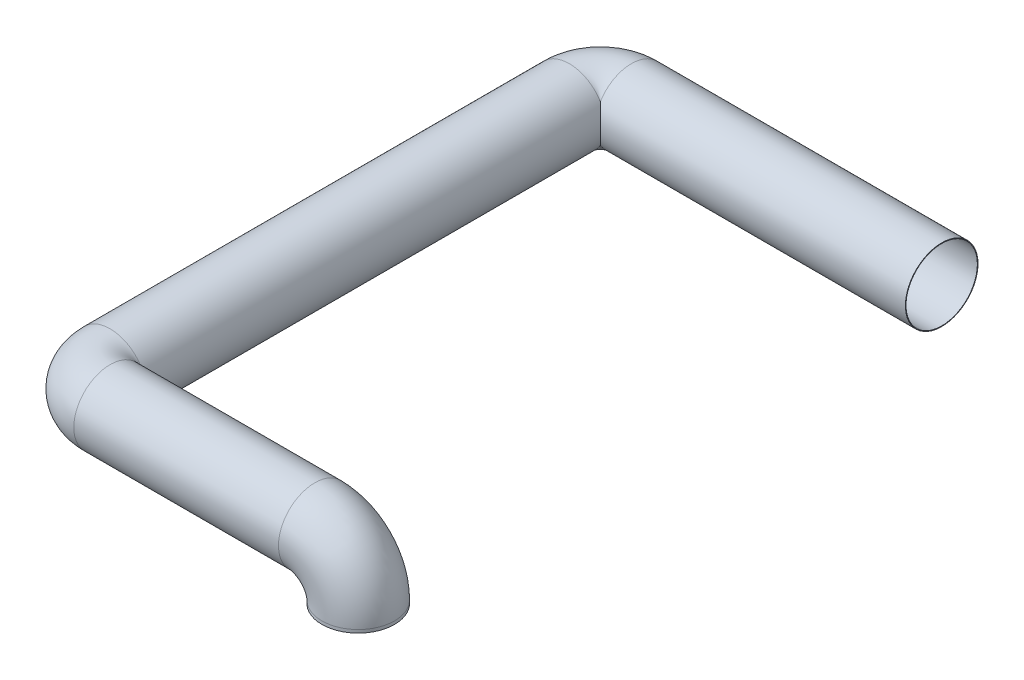
ISO-10303-21;
HEADER;
FILE_DESCRIPTION(('STEP AP214'),'2;1');
FILE_NAME('part.step','',(''),(''),'','','');
FILE_SCHEMA(('AUTOMOTIVE_DESIGN { 1 0 10303 214 1 1 1 1 }'));
ENDSEC;
DATA;
#1=APPLICATION_CONTEXT('core data for automotive mechanical design processes');
#2=APPLICATION_PROTOCOL_DEFINITION('international standard','automotive_design',2000,#1);
#3=PRODUCT_CONTEXT('',#1,'mechanical');
#4=PRODUCT('Part','Part','',(#3));
#5=PRODUCT_RELATED_PRODUCT_CATEGORY('part','',(#4));
#6=PRODUCT_DEFINITION_FORMATION('','',#4);
#7=PRODUCT_DEFINITION_CONTEXT('part definition',#1,'design');
#8=PRODUCT_DEFINITION('design','',#6,#7);
#9=PRODUCT_DEFINITION_SHAPE('','',#8);
#10=(LENGTH_UNIT() NAMED_UNIT(*) SI_UNIT(.MILLI.,.METRE.));
#11=(NAMED_UNIT(*) PLANE_ANGLE_UNIT() SI_UNIT($,.RADIAN.));
#12=(NAMED_UNIT(*) SI_UNIT($,.STERADIAN.) SOLID_ANGLE_UNIT());
#13=UNCERTAINTY_MEASURE_WITH_UNIT(LENGTH_MEASURE(1.E-05),#10,'distance_accuracy_value','');
#14=(GEOMETRIC_REPRESENTATION_CONTEXT(3) GLOBAL_UNCERTAINTY_ASSIGNED_CONTEXT((#13)) GLOBAL_UNIT_ASSIGNED_CONTEXT((#10,
#11,#12)) REPRESENTATION_CONTEXT('',''));
#15=CARTESIAN_POINT('',(0.,0.,0.));
#16=DIRECTION('',(0.,0.,1.));
#17=DIRECTION('',(1.,0.,0.));
#18=AXIS2_PLACEMENT_3D('',#15,#16,#17);
#19=CARTESIAN_POINT('',(12.7,0.,-187.96));
#20=DIRECTION('',(-1.,0.,0.));
#21=DIRECTION('',(0.,0.,1.));
#22=AXIS2_PLACEMENT_3D('',#19,#20,#21);
#23=CIRCLE('',#22,14.859);
#24=TRIMMED_CURVE('',#23,(PARAMETER_VALUE(-2.59577063902792)),
(PARAMETER_VALUE(2.59577063902792)),.T.,.PARAMETER.);
#25=CARTESIAN_POINT('',(12.7,0.,-200.66));
#26=DIRECTION('',(0.,1.,0.));
#27=AXIS1_PLACEMENT('',#25,#26);
#28=SURFACE_OF_REVOLUTION('',#24,#27);
#29=CARTESIAN_POINT('',(12.7,0.,-213.36));
#30=DIRECTION('',(1.,0.,0.));
#31=DIRECTION('',(0.,0.,-1.));
#32=AXIS2_PLACEMENT_3D('',#29,#30,#31);
#33=CIRCLE('',#32,14.859);
#34=CARTESIAN_POINT('',(12.7,-7.71361659664258,-200.66));
#35=VERTEX_POINT('',#34);
#36=CARTESIAN_POINT('',(12.7,7.71361659664258,-200.66));
#37=VERTEX_POINT('',#36);
#38=EDGE_CURVE('E72',#35,#37,#33,.T.);
#39=ORIENTED_EDGE('',*,*,#38,.F.);
#40=CARTESIAN_POINT('',(0.,0.,-200.66));
#41=DIRECTION('',(0.,0.,1.));
#42=DIRECTION('',(1.,0.,0.));
#43=AXIS2_PLACEMENT_3D('',#40,#41,#42);
#44=CIRCLE('',#43,14.859);
#45=EDGE_CURVE('E70',#35,#37,#44,.F.);
#46=ORIENTED_EDGE('',*,*,#45,.T.);
#47=EDGE_LOOP('',(#39,#46));
#48=FACE_BOUND('',#47,.T.);
#49=ADVANCED_FACE('F33',(#48),#28,.T.);
#50=CARTESIAN_POINT('',(114.252492190507,-17.78,0.));
#51=DIRECTION('',(0.,-1.,0.));
#52=DIRECTION('',(1.,0.,0.));
#53=AXIS2_PLACEMENT_3D('',#50,#51,#52);
#54=CYLINDRICAL_SURFACE('',#53,14.859);
#55=CARTESIAN_POINT('',(114.252492190507,-17.78,0.));
#56=DIRECTION('',(0.,1.,0.));
#57=DIRECTION('',(-1.,0.,0.));
#58=AXIS2_PLACEMENT_3D('',#55,#56,#57);
#59=CIRCLE('',#58,14.859);
#60=CARTESIAN_POINT('',(129.111492190507,-17.78,0.));
#61=VERTEX_POINT('',#60);
#62=EDGE_CURVE('E81',#61,#61,#59,.T.);
#63=ORIENTED_EDGE('',*,*,#62,.F.);
#64=EDGE_LOOP('',(#63));
#65=FACE_BOUND('',#64,.T.);
#66=CARTESIAN_POINT('',(114.252492190507,-19.05,0.));
#67=DIRECTION('',(0.,1.,0.));
#68=DIRECTION('',(-1.,0.,0.));
#69=AXIS2_PLACEMENT_3D('',#66,#67,#68);
#70=CIRCLE('',#69,14.859);
#71=CARTESIAN_POINT('',(99.393492190507,-19.05,0.));
#72=VERTEX_POINT('',#71);
#73=EDGE_CURVE('E78',#72,#72,#70,.T.);
#74=ORIENTED_EDGE('',*,*,#73,.T.);
#75=EDGE_LOOP('',(#74));
#76=FACE_BOUND('',#75,.T.);
#77=ADVANCED_FACE('F103',(#65,#76),#54,.T.);
#78=CARTESIAN_POINT('',(96.472492190507,-17.78,0.));
#79=DIRECTION('',(0.,0.,-1.));
#80=DIRECTION('',(0.,1.,0.));
#81=AXIS2_PLACEMENT_3D('',#78,#79,#80);
#82=TOROIDAL_SURFACE('',#81,17.78,14.859);
#83=CARTESIAN_POINT('',(96.472492190507,0.,0.));
#84=DIRECTION('',(1.,0.,0.));
#85=DIRECTION('',(0.,0.,-1.));
#86=AXIS2_PLACEMENT_3D('',#83,#84,#85);
#87=CIRCLE('',#86,14.859);
#88=CARTESIAN_POINT('',(96.472492190507,14.859,0.));
#89=VERTEX_POINT('',#88);
#90=EDGE_CURVE('E67',#89,#89,#87,.F.);
#91=CARTESIAN_POINT('',(96.472492190507,-17.78,0.));
#92=DIRECTION('',(0.,0.,-1.));
#93=DIRECTION('',(0.,1.,0.));
#94=AXIS2_PLACEMENT_3D('',#91,#92,#93);
#95=CIRCLE('',#94,32.639);
#96=EDGE_CURVE('',#89,#61,#95,.T.);
#97=ORIENTED_EDGE('',*,*,#90,.F.);
#98=ORIENTED_EDGE('',*,*,#62,.T.);
#99=ORIENTED_EDGE('',*,*,#96,.T.);
#100=ORIENTED_EDGE('',*,*,#96,.F.);
#101=EDGE_LOOP('',(#97,#99,#98,#100));
#102=FACE_BOUND('',#101,.T.);
#103=ADVANCED_FACE('F100',(#102),#82,.T.);
#104=CARTESIAN_POINT('',(12.7,0.,0.));
#105=DIRECTION('',(1.,0.,0.));
#106=DIRECTION('',(0.,0.,-1.));
#107=AXIS2_PLACEMENT_3D('',#104,#105,#106);
#108=CYLINDRICAL_SURFACE('',#107,14.859);
#109=CARTESIAN_POINT('',(0.,0.,0.));
#110=DIRECTION('',(0.707106781186547,0.,0.707106781186547));
#111=DIRECTION('',(0.707106781186547,0.,-0.707106781186547));
#112=AXIS2_PLACEMENT_3D('',#109,#110,#111);
#113=ELLIPSE('',#112,21.0137993233018,14.859);
#114=CARTESIAN_POINT('',(12.7,7.71361659664255,-12.7));
#115=VERTEX_POINT('',#114);
#116=CARTESIAN_POINT('',(12.7,-7.71361659664255,-12.7));
#117=VERTEX_POINT('',#116);
#118=EDGE_CURVE('E11',#115,#117,#113,.F.);
#119=ORIENTED_EDGE('',*,*,#118,.F.);
#120=CARTESIAN_POINT('',(12.7,0.,0.));
#121=DIRECTION('',(1.,0.,0.));
#122=DIRECTION('',(0.,0.,-1.));
#123=AXIS2_PLACEMENT_3D('',#120,#121,#122);
#124=CIRCLE('',#123,14.859);
#125=EDGE_CURVE('E63',#117,#115,#124,.F.);
#126=ORIENTED_EDGE('',*,*,#125,.F.);
#127=EDGE_LOOP('',(#119,#126));
#128=FACE_BOUND('',#127,.T.);
#129=ORIENTED_EDGE('',*,*,#90,.T.);
#130=EDGE_LOOP('',(#129));
#131=FACE_BOUND('',#130,.T.);
#132=ADVANCED_FACE('F64',(#128,#131),#108,.T.);
#133=CARTESIAN_POINT('',(12.7,0.,0.));
#134=DIRECTION('',(-1.,0.,0.));
#135=DIRECTION('',(0.,0.,1.));
#136=AXIS2_PLACEMENT_3D('',#133,#134,#135);
#137=CIRCLE('',#136,14.859);
#138=TRIMMED_CURVE('',#137,(PARAMETER_VALUE(-2.59577063902792)),
(PARAMETER_VALUE(2.59577063902792)),.T.,.PARAMETER.);
#139=CARTESIAN_POINT('',(12.7,0.,-12.7));
#140=DIRECTION('',(0.,1.,0.));
#141=AXIS1_PLACEMENT('',#139,#140);
#142=SURFACE_OF_REVOLUTION('',#138,#141);
#143=ORIENTED_EDGE('',*,*,#125,.T.);
#144=CARTESIAN_POINT('',(0.,0.,-12.7));
#145=DIRECTION('',(0.,0.,1.));
#146=DIRECTION('',(1.,0.,0.));
#147=AXIS2_PLACEMENT_3D('',#144,#145,#146);
#148=CIRCLE('',#147,14.859);
#149=EDGE_CURVE('E60',#117,#115,#148,.F.);
#150=ORIENTED_EDGE('',*,*,#149,.F.);
#151=EDGE_LOOP('',(#143,#150));
#152=FACE_BOUND('',#151,.T.);
#153=ADVANCED_FACE('F69',(#152),#142,.T.);
#154=CARTESIAN_POINT('',(0.,0.,-200.66));
#155=DIRECTION('',(0.,0.,1.));
#156=DIRECTION('',(1.,0.,0.));
#157=AXIS2_PLACEMENT_3D('',#154,#155,#156);
#158=CYLINDRICAL_SURFACE('',#157,14.859);
#159=ORIENTED_EDGE('',*,*,#45,.F.);
#160=CARTESIAN_POINT('',(0.,0.,-213.36));
#161=DIRECTION('',(-0.707106781186547,0.,0.707106781186547));
#162=DIRECTION('',(0.707106781186547,0.,0.707106781186547));
#163=AXIS2_PLACEMENT_3D('',#160,#161,#162);
#164=ELLIPSE('',#163,21.0137993233018,14.859);
#165=EDGE_CURVE('E41',#35,#37,#164,.T.);
#166=ORIENTED_EDGE('',*,*,#165,.T.);
#167=EDGE_LOOP('',(#159,#166));
#168=FACE_BOUND('',#167,.T.);
#169=ORIENTED_EDGE('',*,*,#149,.T.);
#170=ORIENTED_EDGE('',*,*,#118,.T.);
#171=EDGE_LOOP('',(#169,#170));
#172=FACE_BOUND('',#171,.T.);
#173=ADVANCED_FACE('F58',(#168,#172),#158,.T.);
#174=CARTESIAN_POINT('',(12.7,0.,-213.36));
#175=DIRECTION('',(1.,0.,0.));
#176=DIRECTION('',(0.,0.,-1.));
#177=AXIS2_PLACEMENT_3D('',#174,#175,#176);
#178=CYLINDRICAL_SURFACE('',#177,14.859);
#179=ORIENTED_EDGE('',*,*,#165,.F.);
#180=ORIENTED_EDGE('',*,*,#38,.T.);
#181=EDGE_LOOP('',(#179,#180));
#182=FACE_BOUND('',#181,.T.);
#183=CARTESIAN_POINT('',(139.7,0.,-213.36));
#184=DIRECTION('',(1.,0.,0.));
#185=DIRECTION('',(0.,0.,-1.));
#186=AXIS2_PLACEMENT_3D('',#183,#184,#185);
#187=CIRCLE('',#186,14.859);
#188=CARTESIAN_POINT('',(139.7,0.,-228.219));
#189=VERTEX_POINT('',#188);
#190=EDGE_CURVE('E77',#189,#189,#187,.T.);
#191=ORIENTED_EDGE('',*,*,#190,.F.);
#192=EDGE_LOOP('',(#191));
#193=FACE_BOUND('',#192,.T.);
#194=ADVANCED_FACE('F35',(#182,#193),#178,.T.);
#195=CARTESIAN_POINT('',(114.252492190507,-19.05,0.));
#196=DIRECTION('',(0.,1.,0.));
#197=DIRECTION('',(0.,0.,1.));
#198=AXIS2_PLACEMENT_3D('',#195,#196,#197);
#199=PLANE('',#198);
#200=CARTESIAN_POINT('',(114.252492190507,-19.05,0.));
#201=DIRECTION('',(0.,1.,0.));
#202=DIRECTION('',(0.,0.,1.));
#203=AXIS2_PLACEMENT_3D('',#200,#201,#202);
#204=CIRCLE('',#203,14.605);
#205=CARTESIAN_POINT('',(114.252492190507,-19.05,14.605));
#206=VERTEX_POINT('',#205);
#207=EDGE_CURVE('E83',#206,#206,#204,.T.);
#208=ORIENTED_EDGE('',*,*,#207,.T.);
#209=EDGE_LOOP('',(#208));
#210=FACE_BOUND('',#209,.T.);
#211=ORIENTED_EDGE('',*,*,#73,.F.);
#212=EDGE_LOOP('',(#211));
#213=FACE_BOUND('',#212,.T.);
#214=ADVANCED_FACE('F112',(#210,#213),#199,.F.);
#215=CARTESIAN_POINT('',(139.7,0.,-213.36));
#216=DIRECTION('',(1.,0.,0.));
#217=DIRECTION('',(0.,0.,-1.));
#218=AXIS2_PLACEMENT_3D('',#215,#216,#217);
#219=PLANE('',#218);
#220=CARTESIAN_POINT('',(139.7,0.,-213.36));
#221=DIRECTION('',(1.,0.,0.));
#222=DIRECTION('',(0.,0.,-1.));
#223=AXIS2_PLACEMENT_3D('',#220,#221,#222);
#224=CIRCLE('',#223,14.605);
#225=CARTESIAN_POINT('',(139.7,0.,-227.965));
#226=VERTEX_POINT('',#225);
#227=EDGE_CURVE('E239',#226,#226,#224,.T.);
#228=ORIENTED_EDGE('',*,*,#227,.F.);
#229=EDGE_LOOP('',(#228));
#230=FACE_BOUND('',#229,.T.);
#231=ORIENTED_EDGE('',*,*,#190,.T.);
#232=EDGE_LOOP('',(#231));
#233=FACE_BOUND('',#232,.T.);
#234=ADVANCED_FACE('F114',(#230,#233),#219,.T.);
#235=CARTESIAN_POINT('',(114.252492190507,-17.78,0.));
#236=DIRECTION('',(0.,-1.,0.));
#237=DIRECTION('',(1.,0.,0.));
#238=AXIS2_PLACEMENT_3D('',#235,#236,#237);
#239=CYLINDRICAL_SURFACE('',#238,14.605);
#240=CARTESIAN_POINT('',(114.252492190507,-17.78,0.));
#241=DIRECTION('',(0.,1.,0.));
#242=DIRECTION('',(0.,0.,1.));
#243=AXIS2_PLACEMENT_3D('',#240,#241,#242);
#244=CIRCLE('',#243,14.605);
#245=CARTESIAN_POINT('',(128.857492190507,-17.78,0.));
#246=VERTEX_POINT('',#245);
#247=EDGE_CURVE('E87',#246,#246,#244,.T.);
#248=ORIENTED_EDGE('',*,*,#247,.T.);
#249=EDGE_LOOP('',(#248));
#250=FACE_BOUND('',#249,.T.);
#251=ORIENTED_EDGE('',*,*,#207,.F.);
#252=EDGE_LOOP('',(#251));
#253=FACE_BOUND('',#252,.T.);
#254=ADVANCED_FACE('F120',(#250,#253),#239,.F.);
#255=CARTESIAN_POINT('',(96.472492190507,-17.78,0.));
#256=DIRECTION('',(0.,0.,-1.));
#257=DIRECTION('',(0.,1.,0.));
#258=AXIS2_PLACEMENT_3D('',#255,#256,#257);
#259=TOROIDAL_SURFACE('',#258,17.78,14.605);
#260=CARTESIAN_POINT('',(96.472492190507,0.,0.));
#261=DIRECTION('',(-1.,0.,0.));
#262=DIRECTION('',(0.,0.,1.));
#263=AXIS2_PLACEMENT_3D('',#260,#261,#262);
#264=CIRCLE('',#263,14.605);
#265=CARTESIAN_POINT('',(96.472492190507,14.605,0.));
#266=VERTEX_POINT('',#265);
#267=EDGE_CURVE('E92',#266,#266,#264,.T.);
#268=CARTESIAN_POINT('',(96.472492190507,-17.78,0.));
#269=DIRECTION('',(0.,0.,-1.));
#270=DIRECTION('',(0.,1.,0.));
#271=AXIS2_PLACEMENT_3D('',#268,#269,#270);
#272=CIRCLE('',#271,32.385);
#273=EDGE_CURVE('',#266,#246,#272,.T.);
#274=ORIENTED_EDGE('',*,*,#267,.T.);
#275=ORIENTED_EDGE('',*,*,#247,.F.);
#276=ORIENTED_EDGE('',*,*,#273,.T.);
#277=ORIENTED_EDGE('',*,*,#273,.F.);
#278=EDGE_LOOP('',(#274,#276,#275,#277));
#279=FACE_BOUND('',#278,.T.);
#280=ADVANCED_FACE('F170',(#279),#259,.F.);
#281=CARTESIAN_POINT('',(12.7,0.,0.));
#282=DIRECTION('',(1.,0.,0.));
#283=DIRECTION('',(0.,0.,-1.));
#284=AXIS2_PLACEMENT_3D('',#281,#282,#283);
#285=CYLINDRICAL_SURFACE('',#284,14.605);
#286=CARTESIAN_POINT('',(12.7,0.,0.));
#287=DIRECTION('',(-1.,0.,0.));
#288=DIRECTION('',(0.,0.,1.));
#289=AXIS2_PLACEMENT_3D('',#286,#287,#288);
#290=CIRCLE('',#289,14.605);
#291=CARTESIAN_POINT('',(12.7,0.,14.605));
#292=VERTEX_POINT('',#291);
#293=EDGE_CURVE('E249',#292,#292,#290,.T.);
#294=ORIENTED_EDGE('',*,*,#293,.T.);
#295=EDGE_LOOP('',(#294));
#296=FACE_BOUND('',#295,.T.);
#297=ORIENTED_EDGE('',*,*,#267,.F.);
#298=EDGE_LOOP('',(#297));
#299=FACE_BOUND('',#298,.T.);
#300=ADVANCED_FACE('F179',(#296,#299),#285,.F.);
#301=CARTESIAN_POINT('',(12.7,0.,-12.7));
#302=DIRECTION('',(0.,1.,0.));
#303=DIRECTION('',(0.,0.,1.));
#304=AXIS2_PLACEMENT_3D('',#301,#302,#303);
#305=DEGENERATE_TOROIDAL_SURFACE('',#304,12.7,14.605,.T.);
#306=CARTESIAN_POINT('',(0.,0.,-12.7));
#307=DIRECTION('',(0.,0.,-1.));
#308=DIRECTION('',(-1.,0.,0.));
#309=AXIS2_PLACEMENT_3D('',#306,#307,#308);
#310=CIRCLE('',#309,14.605);
#311=CARTESIAN_POINT('',(-14.605,0.,-12.7));
#312=VERTEX_POINT('',#311);
#313=EDGE_CURVE('E246',#312,#312,#310,.T.);
#314=ORIENTED_EDGE('',*,*,#313,.T.);
#315=EDGE_LOOP('',(#314));
#316=FACE_BOUND('',#315,.T.);
#317=ORIENTED_EDGE('',*,*,#293,.F.);
#318=EDGE_LOOP('',(#317));
#319=FACE_BOUND('',#318,.T.);
#320=ADVANCED_FACE('F189',(#316,#319),#305,.F.);
#321=CARTESIAN_POINT('',(0.,0.,-200.66));
#322=DIRECTION('',(0.,0.,1.));
#323=DIRECTION('',(1.,0.,0.));
#324=AXIS2_PLACEMENT_3D('',#321,#322,#323);
#325=CYLINDRICAL_SURFACE('',#324,14.605);
#326=CARTESIAN_POINT('',(0.,0.,-200.66));
#327=DIRECTION('',(0.,0.,-1.));
#328=DIRECTION('',(-1.,0.,0.));
#329=AXIS2_PLACEMENT_3D('',#326,#327,#328);
#330=CIRCLE('',#329,14.605);
#331=CARTESIAN_POINT('',(-14.605,0.,-200.66));
#332=VERTEX_POINT('',#331);
#333=EDGE_CURVE('E241',#332,#332,#330,.T.);
#334=ORIENTED_EDGE('',*,*,#333,.T.);
#335=EDGE_LOOP('',(#334));
#336=FACE_BOUND('',#335,.T.);
#337=ORIENTED_EDGE('',*,*,#313,.F.);
#338=EDGE_LOOP('',(#337));
#339=FACE_BOUND('',#338,.T.);
#340=ADVANCED_FACE('F199',(#336,#339),#325,.F.);
#341=CARTESIAN_POINT('',(12.7,0.,-200.66));
#342=DIRECTION('',(0.,1.,0.));
#343=DIRECTION('',(0.,0.,1.));
#344=AXIS2_PLACEMENT_3D('',#341,#342,#343);
#345=DEGENERATE_TOROIDAL_SURFACE('',#344,12.7,14.605,.T.);
#346=CARTESIAN_POINT('',(12.7,0.,-213.36));
#347=DIRECTION('',(1.,0.,0.));
#348=DIRECTION('',(0.,0.,-1.));
#349=AXIS2_PLACEMENT_3D('',#346,#347,#348);
#350=CIRCLE('',#349,14.605);
#351=CARTESIAN_POINT('',(12.7,0.,-227.965));
#352=VERTEX_POINT('',#351);
#353=EDGE_CURVE('E236',#352,#352,#350,.T.);
#354=ORIENTED_EDGE('',*,*,#353,.T.);
#355=EDGE_LOOP('',(#354));
#356=FACE_BOUND('',#355,.T.);
#357=ORIENTED_EDGE('',*,*,#333,.F.);
#358=EDGE_LOOP('',(#357));
#359=FACE_BOUND('',#358,.T.);
#360=ADVANCED_FACE('F209',(#356,#359),#345,.F.);
#361=CARTESIAN_POINT('',(12.7,0.,-213.36));
#362=DIRECTION('',(1.,0.,0.));
#363=DIRECTION('',(0.,0.,-1.));
#364=AXIS2_PLACEMENT_3D('',#361,#362,#363);
#365=CYLINDRICAL_SURFACE('',#364,14.605);
#366=ORIENTED_EDGE('',*,*,#353,.F.);
#367=EDGE_LOOP('',(#366));
#368=FACE_BOUND('',#367,.T.);
#369=ORIENTED_EDGE('',*,*,#227,.T.);
#370=EDGE_LOOP('',(#369));
#371=FACE_BOUND('',#370,.T.);
#372=ADVANCED_FACE('F219',(#368,#371),#365,.F.);
#373=CLOSED_SHELL('',(#49,#77,#103,#132,#153,#173,#194,#214,#234,#254,#280,#300,#320,#340,#360,#372));
#374=MANIFOLD_SOLID_BREP('B2',#373);
#375=ADVANCED_BREP_SHAPE_REPRESENTATION('',(#18,#374),#14);
#376=SHAPE_DEFINITION_REPRESENTATION(#9,#375);
ENDSEC;
END-ISO-10303-21;
